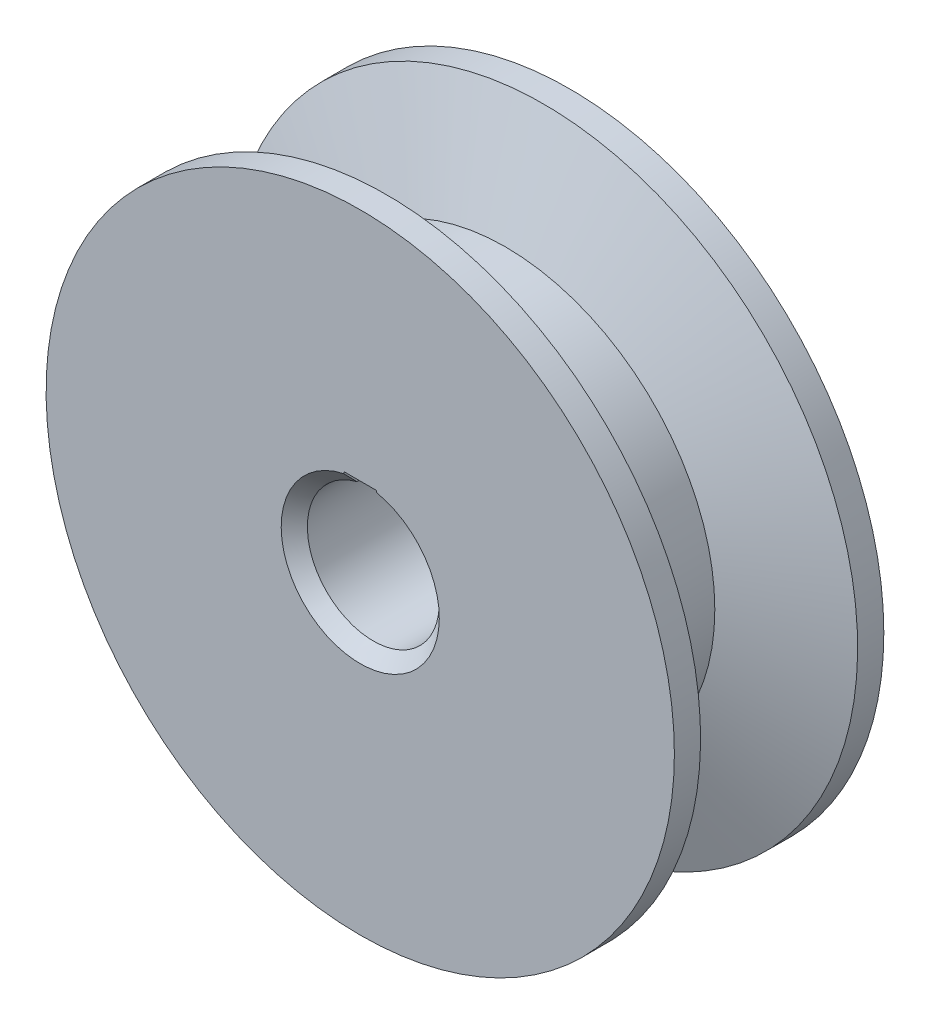
ISO-10303-21;
HEADER;
FILE_DESCRIPTION(('STEP AP214'),'2;1');
FILE_NAME('part.step','',(''),(''),'','','');
FILE_SCHEMA(('AUTOMOTIVE_DESIGN { 1 0 10303 214 1 1 1 1 }'));
ENDSEC;
DATA;
#1=APPLICATION_CONTEXT('core data for automotive mechanical design processes');
#2=APPLICATION_PROTOCOL_DEFINITION('international standard','automotive_design',2000,#1);
#3=PRODUCT_CONTEXT('',#1,'mechanical');
#4=PRODUCT('Part','Part','',(#3));
#5=PRODUCT_RELATED_PRODUCT_CATEGORY('part','',(#4));
#6=PRODUCT_DEFINITION_FORMATION('','',#4);
#7=PRODUCT_DEFINITION_CONTEXT('part definition',#1,'design');
#8=PRODUCT_DEFINITION('design','',#6,#7);
#9=PRODUCT_DEFINITION_SHAPE('','',#8);
#10=(LENGTH_UNIT() NAMED_UNIT(*) SI_UNIT(.MILLI.,.METRE.));
#11=(NAMED_UNIT(*) PLANE_ANGLE_UNIT() SI_UNIT($,.RADIAN.));
#12=(NAMED_UNIT(*) SI_UNIT($,.STERADIAN.) SOLID_ANGLE_UNIT());
#13=UNCERTAINTY_MEASURE_WITH_UNIT(LENGTH_MEASURE(1.E-05),#10,'distance_accuracy_value','');
#14=(GEOMETRIC_REPRESENTATION_CONTEXT(3) GLOBAL_UNCERTAINTY_ASSIGNED_CONTEXT((#13)) GLOBAL_UNIT_ASSIGNED_CONTEXT((#10,
#11,#12)) REPRESENTATION_CONTEXT('',''));
#15=CARTESIAN_POINT('',(0.,0.,0.));
#16=DIRECTION('',(0.,0.,1.));
#17=DIRECTION('',(1.,0.,0.));
#18=AXIS2_PLACEMENT_3D('',#15,#16,#17);
#19=CARTESIAN_POINT('',(0.,0.,6.35));
#20=DIRECTION('',(0.,0.,-1.));
#21=DIRECTION('',(-1.,0.,0.));
#22=AXIS2_PLACEMENT_3D('',#19,#20,#21);
#23=CYLINDRICAL_SURFACE('',#22,19.05);
#24=CARTESIAN_POINT('',(0.,0.,6.35));
#25=DIRECTION('',(0.,0.,1.));
#26=DIRECTION('',(1.,0.,0.));
#27=AXIS2_PLACEMENT_3D('',#24,#25,#26);
#28=CIRCLE('',#27,19.05);
#29=CARTESIAN_POINT('',(19.05,0.,6.35));
#30=VERTEX_POINT('',#29);
#31=EDGE_CURVE('E159',#30,#30,#28,.T.);
#32=ORIENTED_EDGE('',*,*,#31,.F.);
#33=EDGE_LOOP('',(#32));
#34=FACE_BOUND('',#33,.T.);
#35=CARTESIAN_POINT('',(0.,0.,4.76250000000002));
#36=DIRECTION('',(0.,0.,1.));
#37=DIRECTION('',(0.,-1.,0.));
#38=AXIS2_PLACEMENT_3D('',#35,#36,#37);
#39=CIRCLE('',#38,19.05);
#40=CARTESIAN_POINT('',(0.,-19.05,4.76250000000004));
#41=VERTEX_POINT('',#40);
#42=EDGE_CURVE('E163',#41,#41,#39,.T.);
#43=ORIENTED_EDGE('',*,*,#42,.T.);
#44=EDGE_LOOP('',(#43));
#45=FACE_BOUND('',#44,.T.);
#46=ADVANCED_FACE('F34',(#34,#45),#23,.T.);
#47=CARTESIAN_POINT('',(0.,0.,-6.35));
#48=DIRECTION('',(0.,0.,1.));
#49=DIRECTION('',(1.,0.,0.));
#50=AXIS2_PLACEMENT_3D('',#47,#48,#49);
#51=CIRCLE('',#50,19.05);
#52=CARTESIAN_POINT('',(19.05,0.,-6.35));
#53=VERTEX_POINT('',#52);
#54=EDGE_CURVE('E160',#53,#53,#51,.T.);
#55=ORIENTED_EDGE('',*,*,#54,.T.);
#56=EDGE_LOOP('',(#55));
#57=FACE_BOUND('',#56,.T.);
#58=CARTESIAN_POINT('',(0.,0.,-4.76249999999998));
#59=DIRECTION('',(0.,0.,1.));
#60=DIRECTION('',(0.,-1.,0.));
#61=AXIS2_PLACEMENT_3D('',#58,#59,#60);
#62=CIRCLE('',#61,19.05);
#63=CARTESIAN_POINT('',(0.,-19.05,-4.76249999999996));
#64=VERTEX_POINT('',#63);
#65=EDGE_CURVE('E168',#64,#64,#62,.T.);
#66=ORIENTED_EDGE('',*,*,#65,.F.);
#67=EDGE_LOOP('',(#66));
#68=FACE_BOUND('',#67,.T.);
#69=ADVANCED_FACE('F194',(#57,#68),#23,.T.);
#70=CARTESIAN_POINT('',(0.,0.,6.35));
#71=DIRECTION('',(0.,0.,1.));
#72=DIRECTION('',(1.,0.,0.));
#73=AXIS2_PLACEMENT_3D('',#70,#71,#72);
#74=PLANE('',#73);
#75=DIRECTION('',(0.,-1.,0.));
#76=VECTOR('',#75,1.);
#77=CARTESIAN_POINT('',(-1.,4.8,6.35));
#78=LINE('',#77,#76);
#79=CARTESIAN_POINT('',(-1.,4.8,6.35));
#80=VERTEX_POINT('',#79);
#81=CARTESIAN_POINT('',(-1.,4.68828743386112,6.35));
#82=VERTEX_POINT('',#81);
#83=EDGE_CURVE('E120',#80,#82,#78,.T.);
#84=ORIENTED_EDGE('',*,*,#83,.F.);
#85=DIRECTION('',(1.,0.,0.));
#86=VECTOR('',#85,1.);
#87=CARTESIAN_POINT('',(-1.,4.8,6.35));
#88=LINE('',#87,#86);
#89=CARTESIAN_POINT('',(1.,4.8,6.35));
#90=VERTEX_POINT('',#89);
#91=EDGE_CURVE('E117',#80,#90,#88,.T.);
#92=ORIENTED_EDGE('',*,*,#91,.T.);
#93=DIRECTION('',(0.,-1.,0.));
#94=VECTOR('',#93,1.);
#95=CARTESIAN_POINT('',(1.,4.8,6.35));
#96=LINE('',#95,#94);
#97=CARTESIAN_POINT('',(1.,4.68828743386112,6.35));
#98=VERTEX_POINT('',#97);
#99=EDGE_CURVE('E107',#90,#98,#96,.T.);
#100=ORIENTED_EDGE('',*,*,#99,.T.);
#101=CARTESIAN_POINT('',(0.,0.,6.35));
#102=DIRECTION('',(0.,0.,1.));
#103=DIRECTION('',(1.,0.,0.));
#104=AXIS2_PLACEMENT_3D('',#101,#102,#103);
#105=CIRCLE('',#104,4.79375000000001);
#106=EDGE_CURVE('E149',#98,#82,#105,.F.);
#107=ORIENTED_EDGE('',*,*,#106,.T.);
#108=EDGE_LOOP('',(#84,#92,#100,#107));
#109=FACE_BOUND('',#108,.T.);
#110=ORIENTED_EDGE('',*,*,#31,.T.);
#111=EDGE_LOOP('',(#110));
#112=FACE_BOUND('',#111,.T.);
#113=ADVANCED_FACE('F191',(#109,#112),#74,.T.);
#114=CARTESIAN_POINT('',(0.,0.,-6.35));
#115=DIRECTION('',(0.,0.,1.));
#116=DIRECTION('',(1.,0.,0.));
#117=AXIS2_PLACEMENT_3D('',#114,#115,#116);
#118=PLANE('',#117);
#119=DIRECTION('',(1.,0.,0.));
#120=VECTOR('',#119,1.);
#121=CARTESIAN_POINT('',(-1.,4.8,-6.35));
#122=LINE('',#121,#120);
#123=CARTESIAN_POINT('',(-1.,4.8,-6.35));
#124=VERTEX_POINT('',#123);
#125=CARTESIAN_POINT('',(1.,4.8,-6.35));
#126=VERTEX_POINT('',#125);
#127=EDGE_CURVE('E91',#124,#126,#122,.T.);
#128=ORIENTED_EDGE('',*,*,#127,.F.);
#129=DIRECTION('',(0.,-1.,0.));
#130=VECTOR('',#129,1.);
#131=CARTESIAN_POINT('',(-1.,4.8,-6.35));
#132=LINE('',#131,#130);
#133=CARTESIAN_POINT('',(-1.,4.68828743386112,-6.35));
#134=VERTEX_POINT('',#133);
#135=EDGE_CURVE('E115',#124,#134,#132,.T.);
#136=ORIENTED_EDGE('',*,*,#135,.T.);
#137=CARTESIAN_POINT('',(0.,0.,-6.35));
#138=DIRECTION('',(0.,0.,1.));
#139=DIRECTION('',(1.,0.,0.));
#140=AXIS2_PLACEMENT_3D('',#137,#138,#139);
#141=CIRCLE('',#140,4.79375000000001);
#142=CARTESIAN_POINT('',(1.,4.68828743386112,-6.35));
#143=VERTEX_POINT('',#142);
#144=EDGE_CURVE('E114',#134,#143,#141,.T.);
#145=ORIENTED_EDGE('',*,*,#144,.T.);
#146=DIRECTION('',(0.,-1.,0.));
#147=VECTOR('',#146,1.);
#148=CARTESIAN_POINT('',(1.,4.8,-6.35));
#149=LINE('',#148,#147);
#150=EDGE_CURVE('E102',#126,#143,#149,.T.);
#151=ORIENTED_EDGE('',*,*,#150,.F.);
#152=EDGE_LOOP('',(#128,#136,#145,#151));
#153=FACE_BOUND('',#152,.T.);
#154=ORIENTED_EDGE('',*,*,#54,.F.);
#155=EDGE_LOOP('',(#154));
#156=FACE_BOUND('',#155,.T.);
#157=ADVANCED_FACE('F111',(#153,#156),#118,.F.);
#158=CARTESIAN_POINT('',(0.,0.,6.35));
#159=DIRECTION('',(0.,0.,-1.));
#160=DIRECTION('',(-1.,0.,0.));
#161=AXIS2_PLACEMENT_3D('',#158,#159,#160);
#162=CYLINDRICAL_SURFACE('',#161,4.);
#163=DIRECTION('',(0.,0.,-1.));
#164=VECTOR('',#163,1.);
#165=CARTESIAN_POINT('',(-1.,3.87298334620742,6.35));
#166=LINE('',#165,#164);
#167=CARTESIAN_POINT('',(-1.,3.87298334620742,5.55625));
#168=VERTEX_POINT('',#167);
#169=CARTESIAN_POINT('',(-1.,3.87298334620742,-5.55624999999999));
#170=VERTEX_POINT('',#169);
#171=EDGE_CURVE('E62',#168,#170,#166,.T.);
#172=ORIENTED_EDGE('',*,*,#171,.F.);
#173=CARTESIAN_POINT('',(0.,0.,5.55625));
#174=DIRECTION('',(0.,0.,1.));
#175=DIRECTION('',(1.,0.,0.));
#176=AXIS2_PLACEMENT_3D('',#173,#174,#175);
#177=CIRCLE('',#176,4.);
#178=CARTESIAN_POINT('',(1.,3.87298334620742,5.55625));
#179=VERTEX_POINT('',#178);
#180=EDGE_CURVE('E155',#168,#179,#177,.T.);
#181=ORIENTED_EDGE('',*,*,#180,.T.);
#182=DIRECTION('',(0.,0.,-1.));
#183=VECTOR('',#182,1.);
#184=CARTESIAN_POINT('',(1.,3.87298334620742,6.35));
#185=LINE('',#184,#183);
#186=CARTESIAN_POINT('',(1.,3.87298334620742,-5.55624999999999));
#187=VERTEX_POINT('',#186);
#188=EDGE_CURVE('E55',#179,#187,#185,.T.);
#189=ORIENTED_EDGE('',*,*,#188,.T.);
#190=CARTESIAN_POINT('',(0.,0.,-5.55624999999999));
#191=DIRECTION('',(0.,0.,1.));
#192=DIRECTION('',(1.,0.,0.));
#193=AXIS2_PLACEMENT_3D('',#190,#191,#192);
#194=CIRCLE('',#193,4.);
#195=EDGE_CURVE('E152',#187,#170,#194,.F.);
#196=ORIENTED_EDGE('',*,*,#195,.T.);
#197=EDGE_LOOP('',(#172,#181,#189,#196));
#198=FACE_BOUND('',#197,.T.);
#199=ADVANCED_FACE('F184',(#198),#162,.F.);
#200=CARTESIAN_POINT('',(0.,0.,-6.35));
#201=DIRECTION('',(0.,0.,-1.));
#202=DIRECTION('',(-1.,0.,0.));
#203=AXIS2_PLACEMENT_3D('',#200,#201,#202);
#204=CONICAL_SURFACE('',#203,4.79375000000001,0.785398163397447);
#205=CARTESIAN_POINT('',(-1.,1.56101887611725,-3.41010542359546));
#206=CARTESIAN_POINT('',(-1.,1.63031560156575,-3.46849195876421));
#207=CARTESIAN_POINT('',(-1.,1.69908713550223,-3.52749312653378));
#208=CARTESIAN_POINT('',(-1.,1.83578876307596,-3.64645336681732));
#209=CARTESIAN_POINT('',(-1.,1.9037189187993,-3.70641236789517));
#210=CARTESIAN_POINT('',(-1.,2.03894408112879,-3.82701417824531));
#211=CARTESIAN_POINT('',(-1.,2.10623920622221,-3.88765685512656));
#212=CARTESIAN_POINT('',(-1.,2.24034165942328,-4.00948160781823));
#213=CARTESIAN_POINT('',(-1.,2.30714897702573,-4.07066369518287));
#214=CARTESIAN_POINT('',(-1.,2.50696518711948,-4.25480177327273));
#215=CARTESIAN_POINT('',(-1.,2.63940113058984,-4.37837905441005));
#216=CARTESIAN_POINT('',(-1.,2.90328075027668,-4.62660110458155));
#217=CARTESIAN_POINT('',(-1.,3.03472436503238,-4.75124593873149));
#218=CARTESIAN_POINT('',(-1.,3.32191556784922,-5.0250976999536));
#219=CARTESIAN_POINT('',(-1.,3.47751842798497,-5.17445629884275));
#220=CARTESIAN_POINT('',(-1.,3.78805778455671,-5.47386467170963));
#221=CARTESIAN_POINT('',(-1.,3.94299427863716,-5.62391444812673));
#222=CARTESIAN_POINT('',(-1.,4.40710140679969,-6.07477667561109));
#223=CARTESIAN_POINT('',(-1.,4.71557456865608,-6.37630670909209));
#224=CARTESIAN_POINT('',(-1.,5.3316391131339,-6.98053333031647));
#225=CARTESIAN_POINT('',(-1.,5.63923005052874,-7.28323037102957));
#226=CARTESIAN_POINT('',(-1.,6.10013731317611,-7.73775742388932));
#227=CARTESIAN_POINT('',(-1.,6.25369214601082,-7.88934563631696));
#228=CARTESIAN_POINT('',(-1.,6.56067138224566,-8.19265368456172));
#229=CARTESIAN_POINT('',(-1.,6.71409578581255,-8.34437352021004));
#230=CARTESIAN_POINT('',(-1.,6.8674694561832,-8.49614457640453));
#231=B_SPLINE_CURVE_WITH_KNOTS('',3,(#205,#206,#207,#208,#209,#210,#211,#212,#213,#214,#215,
#216,#217,#218,#219,#220,#221,#222,#223,#224,#225,#226,#227,#228,#229,#230),.UNSPECIFIED.,.F.,
.F.,(4,2,2,2,2,2,2,2,2,2,2,2,4),(0.,0.271832465037669,0.54364475033906,0.815405274769698,
1.08717163454839,1.63057208710797,2.17400592401155,2.82105897339017,3.46811430817453,
4.76220468121844,6.05686167325366,6.70418118342157,7.35149986470213),.UNSPECIFIED.);
#232=EDGE_CURVE('E176',#170,#134,#231,.T.);
#233=ORIENTED_EDGE('',*,*,#232,.F.);
#234=ORIENTED_EDGE('',*,*,#195,.F.);
#235=CARTESIAN_POINT('',(1.,1.56101887611724,-3.41010542359546));
#236=CARTESIAN_POINT('',(1.,1.63031560156575,-3.4684919587642));
#237=CARTESIAN_POINT('',(1.,1.69908713550223,-3.52749312653378));
#238=CARTESIAN_POINT('',(1.,1.83578876307596,-3.64645336681731));
#239=CARTESIAN_POINT('',(1.,1.9037189187993,-3.70641236789517));
#240=CARTESIAN_POINT('',(1.,2.03894408112878,-3.82701417824531));
#241=CARTESIAN_POINT('',(1.,2.1062392062222,-3.88765685512656));
#242=CARTESIAN_POINT('',(1.,2.24034165942327,-4.00948160781823));
#243=CARTESIAN_POINT('',(1.,2.30714897702572,-4.07066369518287));
#244=CARTESIAN_POINT('',(1.,2.50696518711947,-4.25480177327273));
#245=CARTESIAN_POINT('',(1.,2.63940113058983,-4.37837905441004));
#246=CARTESIAN_POINT('',(1.,2.90328075027668,-4.62660110458155));
#247=CARTESIAN_POINT('',(1.,3.03472436503238,-4.75124593873149));
#248=CARTESIAN_POINT('',(1.,3.32191556784922,-5.02509769995359));
#249=CARTESIAN_POINT('',(1.,3.47751842798496,-5.17445629884275));
#250=CARTESIAN_POINT('',(1.,3.7880577845567,-5.47386467170962));
#251=CARTESIAN_POINT('',(1.,3.94299427863715,-5.62391444812673));
#252=CARTESIAN_POINT('',(1.,4.40710140679968,-6.07477667561108));
#253=CARTESIAN_POINT('',(1.,4.71557456865607,-6.37630670909209));
#254=CARTESIAN_POINT('',(1.,5.3316391131339,-6.98053333031647));
#255=CARTESIAN_POINT('',(1.,5.63923005052873,-7.28323037102957));
#256=CARTESIAN_POINT('',(1.,6.10013731317611,-7.73775742388931));
#257=CARTESIAN_POINT('',(1.,6.25369214601082,-7.88934563631696));
#258=CARTESIAN_POINT('',(1.,6.56067138224566,-8.19265368456172));
#259=CARTESIAN_POINT('',(1.,6.71409578581255,-8.34437352021004));
#260=CARTESIAN_POINT('',(1.,6.8674694561832,-8.49614457640453));
#261=B_SPLINE_CURVE_WITH_KNOTS('',3,(#235,#236,#237,#238,#239,#240,#241,#242,#243,#244,#245,
#246,#247,#248,#249,#250,#251,#252,#253,#254,#255,#256,#257,#258,#259,#260),.UNSPECIFIED.,.F.,
.F.,(4,2,2,2,2,2,2,2,2,2,2,2,4),(0.,0.271832465037669,0.543644750339059,0.815405274769697,
1.08717163454839,1.63057208710796,2.17400592401155,2.82105897339017,3.46811430817453,
4.76220468121844,6.05686167325366,6.70418118342157,7.35149986470214),.UNSPECIFIED.);
#262=EDGE_CURVE('E126',#187,#143,#261,.T.);
#263=ORIENTED_EDGE('',*,*,#262,.T.);
#264=ORIENTED_EDGE('',*,*,#144,.F.);
#265=EDGE_LOOP('',(#233,#234,#263,#264));
#266=FACE_BOUND('',#265,.T.);
#267=ADVANCED_FACE('F134',(#266),#204,.F.);
#268=CARTESIAN_POINT('',(0.,0.,5.55625));
#269=DIRECTION('',(0.,0.,1.));
#270=DIRECTION('',(1.,0.,0.));
#271=AXIS2_PLACEMENT_3D('',#268,#269,#270);
#272=CONICAL_SURFACE('',#271,4.,0.785398163397449);
#273=CARTESIAN_POINT('',(-1.,6.8674694561832,8.49614457640453));
#274=CARTESIAN_POINT('',(-1.,6.64975244621654,8.28071267299579));
#275=CARTESIAN_POINT('',(-1.,6.43194127718381,8.06537568246429));
#276=CARTESIAN_POINT('',(-1.,5.99603628756994,7.63500048278698));
#277=CARTESIAN_POINT('',(-1.,5.77794247524012,7.41996226528253));
#278=CARTESIAN_POINT('',(-1.,5.34140204805737,6.99031727878305));
#279=CARTESIAN_POINT('',(-1.,5.12295549850613,6.77571044347901));
#280=CARTESIAN_POINT('',(-1.,4.68549164636263,6.34706604570659));
#281=CARTESIAN_POINT('',(-1.,4.46647432694784,6.13302850040156));
#282=CARTESIAN_POINT('',(-1.,4.0275330027154,5.70576283649117));
#283=CARTESIAN_POINT('',(-1.,3.80760876587831,5.49253495577387));
#284=CARTESIAN_POINT('',(-1.,3.47669130053287,5.17377971066675));
#285=CARTESIAN_POINT('',(-1.,3.36621778863858,5.06771301493089));
#286=CARTESIAN_POINT('',(-1.,3.14480722777124,4.85606049036189));
#287=CARTESIAN_POINT('',(-1.,3.03387017142383,4.75047466923508));
#288=CARTESIAN_POINT('',(-1.,2.81134377523251,4.53993161704429));
#289=CARTESIAN_POINT('',(-1.,2.69975426700955,4.43497456380177));
#290=CARTESIAN_POINT('',(-1.,2.47571380933684,4.22599097209072));
#291=CARTESIAN_POINT('',(-1.,2.36326289805641,4.12196439282999));
#292=CARTESIAN_POINT('',(-1.,2.19362358732447,3.9669475361861));
#293=CARTESIAN_POINT('',(-1.,2.13690903032431,3.91543895017809));
#294=CARTESIAN_POINT('',(-1.,2.02308838260683,3.81285767396032));
#295=CARTESIAN_POINT('',(-1.,1.96598229814349,3.7617849768171));
#296=CARTESIAN_POINT('',(-1.,1.85127695419593,3.66017765762622));
#297=CARTESIAN_POINT('',(-1.,1.79367762249874,3.60964311688294));
#298=CARTESIAN_POINT('',(-1.,1.67785223852044,3.50929165435917));
#299=CARTESIAN_POINT('',(-1.,1.61962615189327,3.45947477225967));
#300=CARTESIAN_POINT('',(-1.,1.56101887611724,3.41010542359546));
#301=B_SPLINE_CURVE_WITH_KNOTS('',3,(#273,#274,#275,#276,#277,#278,#279,#280,#281,#282,#283,
#284,#285,#286,#287,#288,#289,#290,#291,#292,#293,#294,#295,#296,#297,#298,#299,#300),
.UNSPECIFIED.,.F.,.F.,(4,2,2,2,2,2,2,2,2,2,2,2,2,4),(0.,0.918860610612831,1.83769497504109,
2.75637524406624,3.6750829030854,4.59404232374619,5.05348758126222,5.51294017596946,
5.97251709422277,6.4320737647874,6.66191342521414,6.89174942286534,7.12161966496889,
7.35150256870881),.UNSPECIFIED.);
#302=EDGE_CURVE('E11',#82,#168,#301,.T.);
#303=ORIENTED_EDGE('',*,*,#302,.F.);
#304=ORIENTED_EDGE('',*,*,#106,.F.);
#305=CARTESIAN_POINT('',(1.,6.8674694561832,8.49614457640453));
#306=CARTESIAN_POINT('',(1.,6.64975244621654,8.28071267299579));
#307=CARTESIAN_POINT('',(1.,6.43194127718381,8.06537568246429));
#308=CARTESIAN_POINT('',(1.,5.99603628756994,7.63500048278698));
#309=CARTESIAN_POINT('',(1.,5.77794247524012,7.41996226528253));
#310=CARTESIAN_POINT('',(1.,5.34140204805737,6.99031727878305));
#311=CARTESIAN_POINT('',(1.,5.12295549850613,6.77571044347901));
#312=CARTESIAN_POINT('',(1.,4.68549164636263,6.34706604570658));
#313=CARTESIAN_POINT('',(1.,4.46647432694784,6.13302850040155));
#314=CARTESIAN_POINT('',(1.,4.0275330027154,5.70576283649117));
#315=CARTESIAN_POINT('',(1.,3.80760876587831,5.49253495577387));
#316=CARTESIAN_POINT('',(1.,3.47669130053287,5.17377971066674));
#317=CARTESIAN_POINT('',(1.,3.36621778863858,5.06771301493089));
#318=CARTESIAN_POINT('',(1.,3.14480722777123,4.85606049036189));
#319=CARTESIAN_POINT('',(1.,3.03387017142383,4.75047466923508));
#320=CARTESIAN_POINT('',(1.,2.81134377523251,4.53993161704429));
#321=CARTESIAN_POINT('',(1.,2.69975426700955,4.43497456380177));
#322=CARTESIAN_POINT('',(1.,2.47571380933684,4.22599097209071));
#323=CARTESIAN_POINT('',(1.,2.36326289805641,4.12196439282999));
#324=CARTESIAN_POINT('',(1.,2.19362358732447,3.9669475361861));
#325=CARTESIAN_POINT('',(1.,2.13690903032431,3.91543895017809));
#326=CARTESIAN_POINT('',(1.,2.02308838260683,3.81285767396032));
#327=CARTESIAN_POINT('',(1.,1.96598229814349,3.7617849768171));
#328=CARTESIAN_POINT('',(1.,1.85127695419592,3.66017765762622));
#329=CARTESIAN_POINT('',(1.,1.79367762249874,3.60964311688294));
#330=CARTESIAN_POINT('',(1.,1.67785223852044,3.50929165435917));
#331=CARTESIAN_POINT('',(1.,1.61962615189327,3.45947477225967));
#332=CARTESIAN_POINT('',(1.,1.56101887611723,3.41010542359546));
#333=B_SPLINE_CURVE_WITH_KNOTS('',3,(#305,#306,#307,#308,#309,#310,#311,#312,#313,#314,#315,
#316,#317,#318,#319,#320,#321,#322,#323,#324,#325,#326,#327,#328,#329,#330,#331,#332),
.UNSPECIFIED.,.F.,.F.,(4,2,2,2,2,2,2,2,2,2,2,2,2,4),(0.,0.918860610612831,1.83769497504109,
2.75637524406624,3.6750829030854,4.59404232374619,5.05348758126222,5.51294017596947,
5.97251709422277,6.4320737647874,6.66191342521414,6.89174942286534,7.12161966496889,
7.35150256870881),.UNSPECIFIED.);
#334=EDGE_CURVE('E48',#98,#179,#333,.T.);
#335=ORIENTED_EDGE('',*,*,#334,.T.);
#336=ORIENTED_EDGE('',*,*,#180,.F.);
#337=EDGE_LOOP('',(#303,#304,#335,#336));
#338=FACE_BOUND('',#337,.T.);
#339=ADVANCED_FACE('F36',(#338),#272,.F.);
#340=CARTESIAN_POINT('',(0.,0.,4.76250000000002));
#341=DIRECTION('',(0.,0.,1.));
#342=DIRECTION('',(0.,-1.,0.));
#343=AXIS2_PLACEMENT_3D('',#340,#341,#342);
#344=CONICAL_SURFACE('',#343,19.05,1.22173047639603);
#345=CARTESIAN_POINT('',(0.,0.,2.45128901240965));
#346=DIRECTION('',(0.,0.,1.));
#347=DIRECTION('',(0.,-1.,0.));
#348=AXIS2_PLACEMENT_3D('',#345,#346,#347);
#349=CIRCLE('',#348,12.7);
#350=CARTESIAN_POINT('',(0.,-12.7,2.45128901240966));
#351=VERTEX_POINT('',#350);
#352=EDGE_CURVE('E174',#351,#351,#349,.T.);
#353=ORIENTED_EDGE('',*,*,#352,.T.);
#354=EDGE_LOOP('',(#353));
#355=FACE_BOUND('',#354,.T.);
#356=ORIENTED_EDGE('',*,*,#42,.F.);
#357=EDGE_LOOP('',(#356));
#358=FACE_BOUND('',#357,.T.);
#359=ADVANCED_FACE('F202',(#355,#358),#344,.T.);
#360=CARTESIAN_POINT('',(0.,0.,-2.45128901240962));
#361=DIRECTION('',(0.,0.,-1.));
#362=DIRECTION('',(0.,1.,0.));
#363=AXIS2_PLACEMENT_3D('',#360,#361,#362);
#364=CONICAL_SURFACE('',#363,12.7,1.22173047639603);
#365=ORIENTED_EDGE('',*,*,#65,.T.);
#366=EDGE_LOOP('',(#365));
#367=FACE_BOUND('',#366,.T.);
#368=CARTESIAN_POINT('',(0.,0.,-2.45128901240962));
#369=DIRECTION('',(0.,0.,1.));
#370=DIRECTION('',(0.,-1.,0.));
#371=AXIS2_PLACEMENT_3D('',#368,#369,#370);
#372=CIRCLE('',#371,12.7);
#373=CARTESIAN_POINT('',(0.,-12.7,-2.45128901240961));
#374=VERTEX_POINT('',#373);
#375=EDGE_CURVE('E171',#374,#374,#372,.T.);
#376=ORIENTED_EDGE('',*,*,#375,.F.);
#377=EDGE_LOOP('',(#376));
#378=FACE_BOUND('',#377,.T.);
#379=ADVANCED_FACE('F204',(#367,#378),#364,.T.);
#380=CARTESIAN_POINT('',(0.,0.,6.35));
#381=DIRECTION('',(0.,0.,1.));
#382=DIRECTION('',(0.,-1.,0.));
#383=AXIS2_PLACEMENT_3D('',#380,#381,#382);
#384=CYLINDRICAL_SURFACE('',#383,12.7);
#385=ORIENTED_EDGE('',*,*,#375,.T.);
#386=EDGE_LOOP('',(#385));
#387=FACE_BOUND('',#386,.T.);
#388=ORIENTED_EDGE('',*,*,#352,.F.);
#389=EDGE_LOOP('',(#388));
#390=FACE_BOUND('',#389,.T.);
#391=ADVANCED_FACE('F211',(#387,#390),#384,.T.);
#392=CARTESIAN_POINT('',(-1.,4.8,-6.35));
#393=DIRECTION('',(-1.,0.,0.));
#394=DIRECTION('',(0.,0.,1.));
#395=AXIS2_PLACEMENT_3D('',#392,#393,#394);
#396=PLANE('',#395);
#397=ORIENTED_EDGE('',*,*,#232,.T.);
#398=ORIENTED_EDGE('',*,*,#135,.F.);
#399=DIRECTION('',(0.,0.,1.));
#400=VECTOR('',#399,1.);
#401=CARTESIAN_POINT('',(-1.,4.8,-6.35));
#402=LINE('',#401,#400);
#403=EDGE_CURVE('E97',#124,#80,#402,.T.);
#404=ORIENTED_EDGE('',*,*,#403,.T.);
#405=ORIENTED_EDGE('',*,*,#83,.T.);
#406=ORIENTED_EDGE('',*,*,#302,.T.);
#407=ORIENTED_EDGE('',*,*,#171,.T.);
#408=EDGE_LOOP('',(#397,#398,#404,#405,#406,#407));
#409=FACE_BOUND('',#408,.T.);
#410=ADVANCED_FACE('F140',(#409),#396,.F.);
#411=CARTESIAN_POINT('',(-1.,4.8,-6.35));
#412=DIRECTION('',(0.,-1.,0.));
#413=DIRECTION('',(0.,0.,-1.));
#414=AXIS2_PLACEMENT_3D('',#411,#412,#413);
#415=PLANE('',#414);
#416=ORIENTED_EDGE('',*,*,#91,.F.);
#417=ORIENTED_EDGE('',*,*,#403,.F.);
#418=ORIENTED_EDGE('',*,*,#127,.T.);
#419=DIRECTION('',(0.,0.,1.));
#420=VECTOR('',#419,1.);
#421=CARTESIAN_POINT('',(1.,4.8,-6.35));
#422=LINE('',#421,#420);
#423=EDGE_CURVE('E95',#126,#90,#422,.T.);
#424=ORIENTED_EDGE('',*,*,#423,.T.);
#425=EDGE_LOOP('',(#416,#417,#418,#424));
#426=FACE_BOUND('',#425,.T.);
#427=ADVANCED_FACE('F94',(#426),#415,.T.);
#428=CARTESIAN_POINT('',(1.,4.8,-6.35));
#429=DIRECTION('',(-1.,0.,0.));
#430=DIRECTION('',(0.,0.,1.));
#431=AXIS2_PLACEMENT_3D('',#428,#429,#430);
#432=PLANE('',#431);
#433=ORIENTED_EDGE('',*,*,#188,.F.);
#434=ORIENTED_EDGE('',*,*,#334,.F.);
#435=ORIENTED_EDGE('',*,*,#99,.F.);
#436=ORIENTED_EDGE('',*,*,#423,.F.);
#437=ORIENTED_EDGE('',*,*,#150,.T.);
#438=ORIENTED_EDGE('',*,*,#262,.F.);
#439=EDGE_LOOP('',(#433,#434,#435,#436,#437,#438));
#440=FACE_BOUND('',#439,.T.);
#441=ADVANCED_FACE('F104',(#440),#432,.T.);
#442=CLOSED_SHELL('',(#46,#69,#113,#157,#199,#267,#339,#359,#379,#391,#410,#427,#441));
#443=MANIFOLD_SOLID_BREP('B2',#442);
#444=ADVANCED_BREP_SHAPE_REPRESENTATION('',(#18,#443),#14);
#445=SHAPE_DEFINITION_REPRESENTATION(#9,#444);
ENDSEC;
END-ISO-10303-21;
